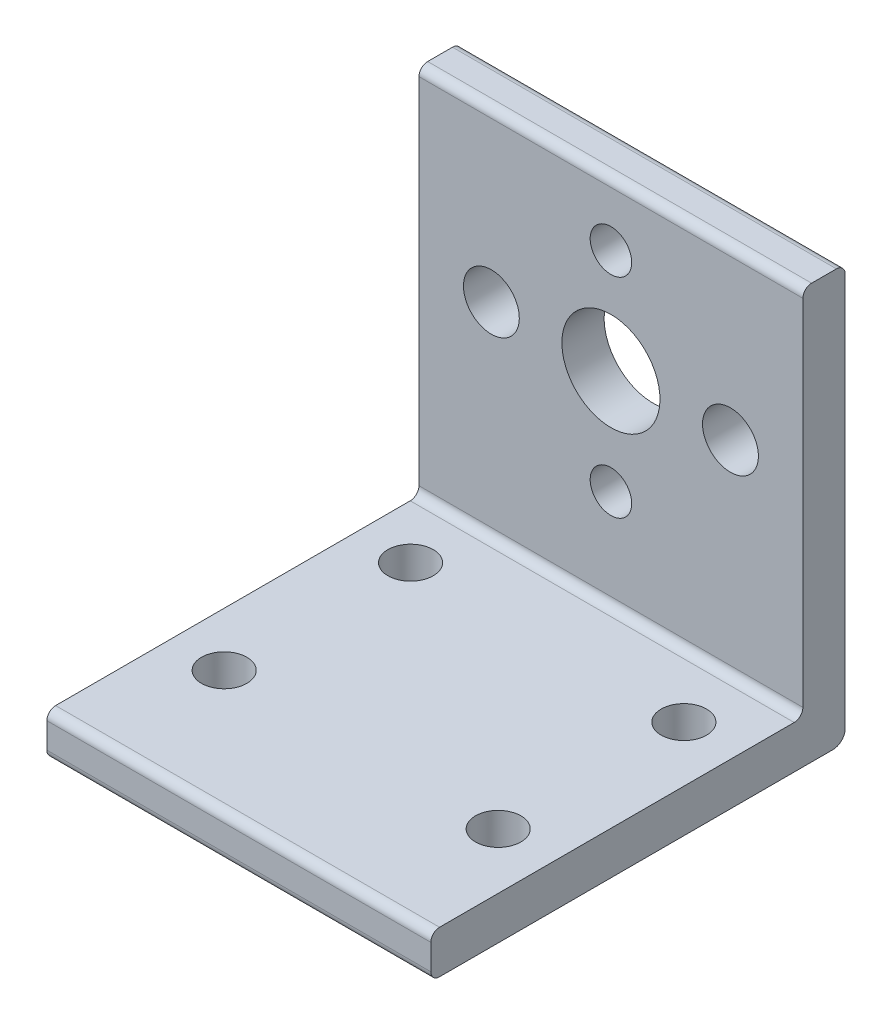
ISO-10303-21;
HEADER;
FILE_DESCRIPTION(('STEP AP214'),'2;1');
FILE_NAME('part.step','',(''),(''),'','','');
FILE_SCHEMA(('AUTOMOTIVE_DESIGN { 1 0 10303 214 1 1 1 1 }'));
ENDSEC;
DATA;
#1=APPLICATION_CONTEXT('core data for automotive mechanical design processes');
#2=APPLICATION_PROTOCOL_DEFINITION('international standard','automotive_design',2000,#1);
#3=PRODUCT_CONTEXT('',#1,'mechanical');
#4=PRODUCT('Part','Part','',(#3));
#5=PRODUCT_RELATED_PRODUCT_CATEGORY('part','',(#4));
#6=PRODUCT_DEFINITION_FORMATION('','',#4);
#7=PRODUCT_DEFINITION_CONTEXT('part definition',#1,'design');
#8=PRODUCT_DEFINITION('design','',#6,#7);
#9=PRODUCT_DEFINITION_SHAPE('','',#8);
#10=(LENGTH_UNIT() NAMED_UNIT(*) SI_UNIT(.MILLI.,.METRE.));
#11=(NAMED_UNIT(*) PLANE_ANGLE_UNIT() SI_UNIT($,.RADIAN.));
#12=(NAMED_UNIT(*) SI_UNIT($,.STERADIAN.) SOLID_ANGLE_UNIT());
#13=UNCERTAINTY_MEASURE_WITH_UNIT(LENGTH_MEASURE(1.E-05),#10,'distance_accuracy_value','');
#14=(GEOMETRIC_REPRESENTATION_CONTEXT(3) GLOBAL_UNCERTAINTY_ASSIGNED_CONTEXT((#13)) GLOBAL_UNIT_ASSIGNED_CONTEXT((#10,
#11,#12)) REPRESENTATION_CONTEXT('',''));
#15=CARTESIAN_POINT('',(0.,0.,0.));
#16=DIRECTION('',(0.,0.,1.));
#17=DIRECTION('',(1.,0.,0.));
#18=AXIS2_PLACEMENT_3D('',#15,#16,#17);
#19=CARTESIAN_POINT('',(27.94,0.,3.0734));
#20=DIRECTION('',(0.,-1.,0.));
#21=DIRECTION('',(0.,0.,-1.));
#22=AXIS2_PLACEMENT_3D('',#19,#20,#21);
#23=PLANE('',#22);
#24=DIRECTION('',(0.,0.,1.));
#25=VECTOR('',#24,1.);
#26=CARTESIAN_POINT('',(27.94,0.,3.0734));
#27=LINE('',#26,#25);
#28=CARTESIAN_POINT('',(27.94,0.,0.635000000000001));
#29=VERTEX_POINT('',#28);
#30=CARTESIAN_POINT('',(27.94,0.,2.4384));
#31=VERTEX_POINT('',#30);
#32=EDGE_CURVE('E182',#29,#31,#27,.T.);
#33=ORIENTED_EDGE('',*,*,#32,.F.);
#34=DIRECTION('',(-1.,0.,0.));
#35=VECTOR('',#34,1.);
#36=CARTESIAN_POINT('',(27.94,0.,0.635));
#37=LINE('',#36,#35);
#38=CARTESIAN_POINT('',(0.,0.,0.635000000000001));
#39=VERTEX_POINT('',#38);
#40=EDGE_CURVE('E241',#29,#39,#37,.T.);
#41=ORIENTED_EDGE('',*,*,#40,.T.);
#42=DIRECTION('',(0.,0.,1.));
#43=VECTOR('',#42,1.);
#44=CARTESIAN_POINT('',(0.,0.,3.0734));
#45=LINE('',#44,#43);
#46=CARTESIAN_POINT('',(0.,0.,2.4384));
#47=VERTEX_POINT('',#46);
#48=EDGE_CURVE('E173',#39,#47,#45,.T.);
#49=ORIENTED_EDGE('',*,*,#48,.T.);
#50=DIRECTION('',(-1.,0.,0.));
#51=VECTOR('',#50,1.);
#52=CARTESIAN_POINT('',(27.94,0.,2.4384));
#53=LINE('',#52,#51);
#54=EDGE_CURVE('E238',#47,#31,#53,.F.);
#55=ORIENTED_EDGE('',*,*,#54,.T.);
#56=EDGE_LOOP('',(#33,#41,#49,#55));
#57=FACE_BOUND('',#56,.T.);
#58=ADVANCED_FACE('F47',(#57),#23,.F.);
#59=CARTESIAN_POINT('',(27.94,-27.051,3.0734));
#60=DIRECTION('',(0.,0.,-1.));
#61=DIRECTION('',(0.,1.,0.));
#62=AXIS2_PLACEMENT_3D('',#59,#60,#61);
#63=PLANE('',#62);
#64=CARTESIAN_POINT('',(13.97,-4.6101,3.0734));
#65=DIRECTION('',(0.,0.,-1.));
#66=DIRECTION('',(0.,1.,0.));
#67=AXIS2_PLACEMENT_3D('',#64,#65,#66);
#68=CIRCLE('',#67,1.5113);
#69=CARTESIAN_POINT('',(13.97,-3.0988,3.0734));
#70=VERTEX_POINT('',#69);
#71=EDGE_CURVE('E268',#70,#70,#68,.F.);
#72=ORIENTED_EDGE('',*,*,#71,.F.);
#73=EDGE_LOOP('',(#72));
#74=FACE_BOUND('',#73,.T.);
#75=CARTESIAN_POINT('',(5.2705,-12.2047,3.0734));
#76=DIRECTION('',(0.,0.,-1.));
#77=DIRECTION('',(0.,1.,0.));
#78=AXIS2_PLACEMENT_3D('',#75,#76,#77);
#79=CIRCLE('',#78,2.032);
#80=CARTESIAN_POINT('',(5.2705,-10.1727,3.0734));
#81=VERTEX_POINT('',#80);
#82=EDGE_CURVE('E271',#81,#81,#79,.F.);
#83=ORIENTED_EDGE('',*,*,#82,.F.);
#84=EDGE_LOOP('',(#83));
#85=FACE_BOUND('',#84,.T.);
#86=CARTESIAN_POINT('',(22.6695,-12.2047,3.0734));
#87=DIRECTION('',(0.,0.,-1.));
#88=DIRECTION('',(0.,1.,0.));
#89=AXIS2_PLACEMENT_3D('',#86,#87,#88);
#90=CIRCLE('',#89,2.032);
#91=CARTESIAN_POINT('',(22.6695,-10.1727,3.0734));
#92=VERTEX_POINT('',#91);
#93=EDGE_CURVE('E289',#92,#92,#90,.F.);
#94=ORIENTED_EDGE('',*,*,#93,.F.);
#95=EDGE_LOOP('',(#94));
#96=FACE_BOUND('',#95,.T.);
#97=CARTESIAN_POINT('',(13.97,-19.7993,3.0734));
#98=DIRECTION('',(0.,0.,-1.));
#99=DIRECTION('',(0.,1.,0.));
#100=AXIS2_PLACEMENT_3D('',#97,#98,#99);
#101=CIRCLE('',#100,1.5113);
#102=CARTESIAN_POINT('',(13.97,-18.288,3.0734));
#103=VERTEX_POINT('',#102);
#104=EDGE_CURVE('E293',#103,#103,#101,.F.);
#105=ORIENTED_EDGE('',*,*,#104,.F.);
#106=EDGE_LOOP('',(#105));
#107=FACE_BOUND('',#106,.T.);
#108=CARTESIAN_POINT('',(13.97,-12.2047,3.0734));
#109=DIRECTION('',(0.,0.,-1.));
#110=DIRECTION('',(0.,1.,0.));
#111=AXIS2_PLACEMENT_3D('',#108,#109,#110);
#112=CIRCLE('',#111,3.5687);
#113=CARTESIAN_POINT('',(13.97,-8.636,3.0734));
#114=VERTEX_POINT('',#113);
#115=EDGE_CURVE('E297',#114,#114,#112,.F.);
#116=ORIENTED_EDGE('',*,*,#115,.F.);
#117=EDGE_LOOP('',(#116));
#118=FACE_BOUND('',#117,.T.);
#119=DIRECTION('',(0.,-1.,0.));
#120=VECTOR('',#119,1.);
#121=CARTESIAN_POINT('',(27.94,-27.051,3.0734));
#122=LINE('',#121,#120);
#123=CARTESIAN_POINT('',(27.94,-0.635,3.0734));
#124=VERTEX_POINT('',#123);
#125=CARTESIAN_POINT('',(27.94,-26.416,3.0734));
#126=VERTEX_POINT('',#125);
#127=EDGE_CURVE('E281',#124,#126,#122,.T.);
#128=ORIENTED_EDGE('',*,*,#127,.F.);
#129=DIRECTION('',(-1.,0.,0.));
#130=VECTOR('',#129,1.);
#131=CARTESIAN_POINT('',(27.94,-0.635,3.0734));
#132=LINE('',#131,#130);
#133=CARTESIAN_POINT('',(0.,-0.635,3.0734));
#134=VERTEX_POINT('',#133);
#135=EDGE_CURVE('E11',#124,#134,#132,.T.);
#136=ORIENTED_EDGE('',*,*,#135,.T.);
#137=DIRECTION('',(0.,-1.,0.));
#138=VECTOR('',#137,1.);
#139=CARTESIAN_POINT('',(0.,-27.051,3.0734));
#140=LINE('',#139,#138);
#141=CARTESIAN_POINT('',(0.,-26.416,3.0734));
#142=VERTEX_POINT('',#141);
#143=EDGE_CURVE('E166',#134,#142,#140,.T.);
#144=ORIENTED_EDGE('',*,*,#143,.T.);
#145=DIRECTION('',(-1.,0.,0.));
#146=VECTOR('',#145,1.);
#147=CARTESIAN_POINT('',(27.94,-26.416,3.0734));
#148=LINE('',#147,#146);
#149=EDGE_CURVE('E147',#142,#126,#148,.F.);
#150=ORIENTED_EDGE('',*,*,#149,.T.);
#151=EDGE_LOOP('',(#128,#136,#144,#150));
#152=FACE_BOUND('',#151,.T.);
#153=ADVANCED_FACE('F368',(#74,#85,#96,#107,#118,#152),#63,.F.);
#154=CARTESIAN_POINT('',(27.94,-27.051,30.1498));
#155=DIRECTION('',(0.,-1.,0.));
#156=DIRECTION('',(0.,0.,-1.));
#157=AXIS2_PLACEMENT_3D('',#154,#155,#156);
#158=PLANE('',#157);
#159=CARTESIAN_POINT('',(23.9014,-27.051,7.6962));
#160=DIRECTION('',(0.,-1.,0.));
#161=DIRECTION('',(0.,0.,-1.));
#162=AXIS2_PLACEMENT_3D('',#159,#160,#161);
#163=CIRCLE('',#162,1.651);
#164=CARTESIAN_POINT('',(23.9014,-27.051,6.0452));
#165=VERTEX_POINT('',#164);
#166=EDGE_CURVE('E318',#165,#165,#163,.F.);
#167=ORIENTED_EDGE('',*,*,#166,.F.);
#168=EDGE_LOOP('',(#167));
#169=FACE_BOUND('',#168,.T.);
#170=CARTESIAN_POINT('',(3.9116,-27.051,21.1582));
#171=DIRECTION('',(0.,-1.,0.));
#172=DIRECTION('',(0.,0.,-1.));
#173=AXIS2_PLACEMENT_3D('',#170,#171,#172);
#174=CIRCLE('',#173,1.651);
#175=CARTESIAN_POINT('',(3.9116,-27.051,19.5072));
#176=VERTEX_POINT('',#175);
#177=EDGE_CURVE('E325',#176,#176,#174,.F.);
#178=ORIENTED_EDGE('',*,*,#177,.F.);
#179=EDGE_LOOP('',(#178));
#180=FACE_BOUND('',#179,.T.);
#181=CARTESIAN_POINT('',(23.876,-27.051,21.1836));
#182=DIRECTION('',(0.,-1.,0.));
#183=DIRECTION('',(0.,0.,-1.));
#184=AXIS2_PLACEMENT_3D('',#181,#182,#183);
#185=CIRCLE('',#184,1.651);
#186=CARTESIAN_POINT('',(23.876,-27.051,19.5326));
#187=VERTEX_POINT('',#186);
#188=EDGE_CURVE('E329',#187,#187,#185,.F.);
#189=ORIENTED_EDGE('',*,*,#188,.F.);
#190=EDGE_LOOP('',(#189));
#191=FACE_BOUND('',#190,.T.);
#192=CARTESIAN_POINT('',(3.9116,-27.051,7.5946));
#193=DIRECTION('',(0.,-1.,0.));
#194=DIRECTION('',(0.,0.,-1.));
#195=AXIS2_PLACEMENT_3D('',#192,#193,#194);
#196=CIRCLE('',#195,1.651);
#197=CARTESIAN_POINT('',(3.9116,-27.051,5.9436));
#198=VERTEX_POINT('',#197);
#199=EDGE_CURVE('E333',#198,#198,#196,.F.);
#200=ORIENTED_EDGE('',*,*,#199,.F.);
#201=EDGE_LOOP('',(#200));
#202=FACE_BOUND('',#201,.T.);
#203=DIRECTION('',(0.,0.,1.));
#204=VECTOR('',#203,1.);
#205=CARTESIAN_POINT('',(0.,-27.051,30.1498));
#206=LINE('',#205,#204);
#207=CARTESIAN_POINT('',(0.,-27.051,3.7084));
#208=VERTEX_POINT('',#207);
#209=CARTESIAN_POINT('',(0.,-27.051,29.5148));
#210=VERTEX_POINT('',#209);
#211=EDGE_CURVE('E155',#208,#210,#206,.T.);
#212=ORIENTED_EDGE('',*,*,#211,.T.);
#213=DIRECTION('',(-1.,0.,0.));
#214=VECTOR('',#213,1.);
#215=CARTESIAN_POINT('',(27.94,-27.051,29.5148));
#216=LINE('',#215,#214);
#217=CARTESIAN_POINT('',(27.94,-27.051,29.5148));
#218=VERTEX_POINT('',#217);
#219=EDGE_CURVE('E63',#210,#218,#216,.F.);
#220=ORIENTED_EDGE('',*,*,#219,.T.);
#221=DIRECTION('',(0.,0.,1.));
#222=VECTOR('',#221,1.);
#223=CARTESIAN_POINT('',(27.94,-27.051,30.1498));
#224=LINE('',#223,#222);
#225=CARTESIAN_POINT('',(27.94,-27.051,3.7084));
#226=VERTEX_POINT('',#225);
#227=EDGE_CURVE('E156',#226,#218,#224,.T.);
#228=ORIENTED_EDGE('',*,*,#227,.F.);
#229=DIRECTION('',(-1.,0.,0.));
#230=VECTOR('',#229,1.);
#231=CARTESIAN_POINT('',(0.,-27.051,3.7084));
#232=LINE('',#231,#230);
#233=EDGE_CURVE('E145',#226,#208,#232,.T.);
#234=ORIENTED_EDGE('',*,*,#233,.T.);
#235=EDGE_LOOP('',(#212,#220,#228,#234));
#236=FACE_BOUND('',#235,.T.);
#237=ADVANCED_FACE('F154',(#169,#180,#191,#202,#236),#158,.F.);
#238=CARTESIAN_POINT('',(27.94,-30.1752,30.1498));
#239=DIRECTION('',(0.,0.,-1.));
#240=DIRECTION('',(-1.,0.,0.));
#241=AXIS2_PLACEMENT_3D('',#238,#239,#240);
#242=PLANE('',#241);
#243=DIRECTION('',(0.,-1.,0.));
#244=VECTOR('',#243,1.);
#245=CARTESIAN_POINT('',(0.,-30.1752,30.1498));
#246=LINE('',#245,#244);
#247=CARTESIAN_POINT('',(0.,-27.686,30.1498));
#248=VERTEX_POINT('',#247);
#249=CARTESIAN_POINT('',(0.,-29.5402,30.1498));
#250=VERTEX_POINT('',#249);
#251=EDGE_CURVE('E165',#248,#250,#246,.T.);
#252=ORIENTED_EDGE('',*,*,#251,.T.);
#253=DIRECTION('',(-1.,0.,0.));
#254=VECTOR('',#253,1.);
#255=CARTESIAN_POINT('',(27.94,-29.5402,30.1498));
#256=LINE('',#255,#254);
#257=CARTESIAN_POINT('',(27.94,-29.5402,30.1498));
#258=VERTEX_POINT('',#257);
#259=EDGE_CURVE('E222',#250,#258,#256,.F.);
#260=ORIENTED_EDGE('',*,*,#259,.T.);
#261=DIRECTION('',(0.,-1.,0.));
#262=VECTOR('',#261,1.);
#263=CARTESIAN_POINT('',(27.94,-30.1752,30.1498));
#264=LINE('',#263,#262);
#265=CARTESIAN_POINT('',(27.94,-27.686,30.1498));
#266=VERTEX_POINT('',#265);
#267=EDGE_CURVE('E276',#266,#258,#264,.T.);
#268=ORIENTED_EDGE('',*,*,#267,.F.);
#269=DIRECTION('',(-1.,0.,0.));
#270=VECTOR('',#269,1.);
#271=CARTESIAN_POINT('',(27.94,-27.686,30.1498));
#272=LINE('',#271,#270);
#273=EDGE_CURVE('E218',#266,#248,#272,.T.);
#274=ORIENTED_EDGE('',*,*,#273,.T.);
#275=EDGE_LOOP('',(#252,#260,#268,#274));
#276=FACE_BOUND('',#275,.T.);
#277=ADVANCED_FACE('F367',(#276),#242,.F.);
#278=CARTESIAN_POINT('',(27.94,-30.1752,0.));
#279=DIRECTION('',(0.,1.,0.));
#280=DIRECTION('',(0.,0.,1.));
#281=AXIS2_PLACEMENT_3D('',#278,#279,#280);
#282=PLANE('',#281);
#283=CARTESIAN_POINT('',(23.9014,-30.1752,7.6962));
#284=DIRECTION('',(0.,1.,0.));
#285=DIRECTION('',(0.,0.,1.));
#286=AXIS2_PLACEMENT_3D('',#283,#284,#285);
#287=CIRCLE('',#286,1.651);
#288=CARTESIAN_POINT('',(23.9014,-30.1752,9.3472));
#289=VERTEX_POINT('',#288);
#290=EDGE_CURVE('E341',#289,#289,#287,.T.);
#291=ORIENTED_EDGE('',*,*,#290,.T.);
#292=EDGE_LOOP('',(#291));
#293=FACE_BOUND('',#292,.T.);
#294=CARTESIAN_POINT('',(3.9116,-30.1752,21.1582));
#295=DIRECTION('',(0.,1.,0.));
#296=DIRECTION('',(0.,0.,1.));
#297=AXIS2_PLACEMENT_3D('',#294,#295,#296);
#298=CIRCLE('',#297,1.651);
#299=CARTESIAN_POINT('',(3.9116,-30.1752,22.8092));
#300=VERTEX_POINT('',#299);
#301=EDGE_CURVE('E342',#300,#300,#298,.T.);
#302=ORIENTED_EDGE('',*,*,#301,.T.);
#303=EDGE_LOOP('',(#302));
#304=FACE_BOUND('',#303,.T.);
#305=CARTESIAN_POINT('',(23.876,-30.1752,21.1836));
#306=DIRECTION('',(0.,1.,0.));
#307=DIRECTION('',(0.,0.,1.));
#308=AXIS2_PLACEMENT_3D('',#305,#306,#307);
#309=CIRCLE('',#308,1.651);
#310=CARTESIAN_POINT('',(23.876,-30.1752,22.8346));
#311=VERTEX_POINT('',#310);
#312=EDGE_CURVE('E346',#311,#311,#309,.T.);
#313=ORIENTED_EDGE('',*,*,#312,.T.);
#314=EDGE_LOOP('',(#313));
#315=FACE_BOUND('',#314,.T.);
#316=CARTESIAN_POINT('',(3.9116,-30.1752,7.5946));
#317=DIRECTION('',(0.,1.,0.));
#318=DIRECTION('',(0.,0.,1.));
#319=AXIS2_PLACEMENT_3D('',#316,#317,#318);
#320=CIRCLE('',#319,1.651);
#321=CARTESIAN_POINT('',(3.9116,-30.1752,9.2456));
#322=VERTEX_POINT('',#321);
#323=EDGE_CURVE('E337',#322,#322,#320,.T.);
#324=ORIENTED_EDGE('',*,*,#323,.T.);
#325=EDGE_LOOP('',(#324));
#326=FACE_BOUND('',#325,.T.);
#327=DIRECTION('',(0.,0.,-1.));
#328=VECTOR('',#327,1.);
#329=CARTESIAN_POINT('',(27.94,-30.1752,0.));
#330=LINE('',#329,#328);
#331=CARTESIAN_POINT('',(27.94,-30.1752,29.5148));
#332=VERTEX_POINT('',#331);
#333=CARTESIAN_POINT('',(27.94,-30.1752,0.888999999999996));
#334=VERTEX_POINT('',#333);
#335=EDGE_CURVE('E259',#332,#334,#330,.T.);
#336=ORIENTED_EDGE('',*,*,#335,.F.);
#337=DIRECTION('',(-1.,0.,0.));
#338=VECTOR('',#337,1.);
#339=CARTESIAN_POINT('',(27.94,-30.1752,29.5148));
#340=LINE('',#339,#338);
#341=CARTESIAN_POINT('',(0.,-30.1752,29.5148));
#342=VERTEX_POINT('',#341);
#343=EDGE_CURVE('E203',#332,#342,#340,.T.);
#344=ORIENTED_EDGE('',*,*,#343,.T.);
#345=DIRECTION('',(0.,0.,-1.));
#346=VECTOR('',#345,1.);
#347=CARTESIAN_POINT('',(0.,-30.1752,0.));
#348=LINE('',#347,#346);
#349=CARTESIAN_POINT('',(0.,-30.1752,0.888999999999996));
#350=VERTEX_POINT('',#349);
#351=EDGE_CURVE('E171',#342,#350,#348,.T.);
#352=ORIENTED_EDGE('',*,*,#351,.T.);
#353=DIRECTION('',(-1.,0.,0.));
#354=VECTOR('',#353,1.);
#355=CARTESIAN_POINT('',(27.94,-30.1752,0.888999999999996));
#356=LINE('',#355,#354);
#357=EDGE_CURVE('E196',#350,#334,#356,.F.);
#358=ORIENTED_EDGE('',*,*,#357,.T.);
#359=EDGE_LOOP('',(#336,#344,#352,#358));
#360=FACE_BOUND('',#359,.T.);
#361=ADVANCED_FACE('F354',(#293,#304,#315,#326,#360),#282,.F.);
#362=CARTESIAN_POINT('',(27.94,0.,0.));
#363=DIRECTION('',(0.,0.,1.));
#364=DIRECTION('',(0.,-1.,0.));
#365=AXIS2_PLACEMENT_3D('',#362,#363,#364);
#366=PLANE('',#365);
#367=CARTESIAN_POINT('',(13.97,-4.6101,0.));
#368=DIRECTION('',(0.,0.,1.));
#369=DIRECTION('',(1.,0.,0.));
#370=AXIS2_PLACEMENT_3D('',#367,#368,#369);
#371=CIRCLE('',#370,1.5113);
#372=CARTESIAN_POINT('',(15.4813,-4.6101,0.));
#373=VERTEX_POINT('',#372);
#374=EDGE_CURVE('E305',#373,#373,#371,.T.);
#375=ORIENTED_EDGE('',*,*,#374,.T.);
#376=EDGE_LOOP('',(#375));
#377=FACE_BOUND('',#376,.T.);
#378=CARTESIAN_POINT('',(5.2705,-12.2047,0.));
#379=DIRECTION('',(0.,0.,1.));
#380=DIRECTION('',(1.,0.,0.));
#381=AXIS2_PLACEMENT_3D('',#378,#379,#380);
#382=CIRCLE('',#381,2.032);
#383=CARTESIAN_POINT('',(7.3025,-12.2047,0.));
#384=VERTEX_POINT('',#383);
#385=EDGE_CURVE('E306',#384,#384,#382,.T.);
#386=ORIENTED_EDGE('',*,*,#385,.T.);
#387=EDGE_LOOP('',(#386));
#388=FACE_BOUND('',#387,.T.);
#389=CARTESIAN_POINT('',(22.6695,-12.2047,0.));
#390=DIRECTION('',(0.,0.,1.));
#391=DIRECTION('',(-1.,0.,0.));
#392=AXIS2_PLACEMENT_3D('',#389,#390,#391);
#393=CIRCLE('',#392,2.032);
#394=CARTESIAN_POINT('',(20.6375,-12.2047,0.));
#395=VERTEX_POINT('',#394);
#396=EDGE_CURVE('E310',#395,#395,#393,.T.);
#397=ORIENTED_EDGE('',*,*,#396,.T.);
#398=EDGE_LOOP('',(#397));
#399=FACE_BOUND('',#398,.T.);
#400=CARTESIAN_POINT('',(13.97,-19.7993,0.));
#401=DIRECTION('',(0.,0.,1.));
#402=DIRECTION('',(-1.,0.,0.));
#403=AXIS2_PLACEMENT_3D('',#400,#401,#402);
#404=CIRCLE('',#403,1.5113);
#405=CARTESIAN_POINT('',(12.4587,-19.7993,0.));
#406=VERTEX_POINT('',#405);
#407=EDGE_CURVE('E314',#406,#406,#404,.T.);
#408=ORIENTED_EDGE('',*,*,#407,.T.);
#409=EDGE_LOOP('',(#408));
#410=FACE_BOUND('',#409,.T.);
#411=CARTESIAN_POINT('',(13.97,-12.2047,0.));
#412=DIRECTION('',(0.,0.,1.));
#413=DIRECTION('',(1.,0.,0.));
#414=AXIS2_PLACEMENT_3D('',#411,#412,#413);
#415=CIRCLE('',#414,3.5687);
#416=CARTESIAN_POINT('',(17.5387,-12.2047,0.));
#417=VERTEX_POINT('',#416);
#418=EDGE_CURVE('E301',#417,#417,#415,.T.);
#419=ORIENTED_EDGE('',*,*,#418,.T.);
#420=EDGE_LOOP('',(#419));
#421=FACE_BOUND('',#420,.T.);
#422=DIRECTION('',(0.,1.,0.));
#423=VECTOR('',#422,1.);
#424=CARTESIAN_POINT('',(0.,0.,0.));
#425=LINE('',#424,#423);
#426=CARTESIAN_POINT('',(0.,-29.2862,0.));
#427=VERTEX_POINT('',#426);
#428=CARTESIAN_POINT('',(0.,-0.635,0.));
#429=VERTEX_POINT('',#428);
#430=EDGE_CURVE('E179',#427,#429,#425,.T.);
#431=ORIENTED_EDGE('',*,*,#430,.T.);
#432=DIRECTION('',(-1.,0.,0.));
#433=VECTOR('',#432,1.);
#434=CARTESIAN_POINT('',(27.94,-0.635,0.));
#435=LINE('',#434,#433);
#436=CARTESIAN_POINT('',(27.94,-0.635,0.));
#437=VERTEX_POINT('',#436);
#438=EDGE_CURVE('E56',#429,#437,#435,.F.);
#439=ORIENTED_EDGE('',*,*,#438,.T.);
#440=DIRECTION('',(0.,1.,0.));
#441=VECTOR('',#440,1.);
#442=CARTESIAN_POINT('',(27.94,0.,0.));
#443=LINE('',#442,#441);
#444=CARTESIAN_POINT('',(27.94,-29.2862,0.));
#445=VERTEX_POINT('',#444);
#446=EDGE_CURVE('E158',#445,#437,#443,.T.);
#447=ORIENTED_EDGE('',*,*,#446,.F.);
#448=DIRECTION('',(-1.,0.,0.));
#449=VECTOR('',#448,1.);
#450=CARTESIAN_POINT('',(27.94,-29.2862,0.));
#451=LINE('',#450,#449);
#452=EDGE_CURVE('E188',#445,#427,#451,.T.);
#453=ORIENTED_EDGE('',*,*,#452,.T.);
#454=EDGE_LOOP('',(#431,#439,#447,#453));
#455=FACE_BOUND('',#454,.T.);
#456=ADVANCED_FACE('F249',(#377,#388,#399,#410,#421,#455),#366,.F.);
#457=CARTESIAN_POINT('',(27.94,0.,0.));
#458=DIRECTION('',(-1.,0.,0.));
#459=DIRECTION('',(0.,0.,1.));
#460=AXIS2_PLACEMENT_3D('',#457,#458,#459);
#461=PLANE('',#460);
#462=ORIENTED_EDGE('',*,*,#267,.T.);
#463=CARTESIAN_POINT('',(27.94,-29.5402,29.5148));
#464=DIRECTION('',(-1.,0.,0.));
#465=DIRECTION('',(0.,0.,1.));
#466=AXIS2_PLACEMENT_3D('',#463,#464,#465);
#467=CIRCLE('',#466,0.635);
#468=EDGE_CURVE('E233',#258,#332,#467,.F.);
#469=ORIENTED_EDGE('',*,*,#468,.T.);
#470=ORIENTED_EDGE('',*,*,#335,.T.);
#471=CARTESIAN_POINT('',(27.94,-29.2862,0.888999999999996));
#472=DIRECTION('',(-1.,0.,0.));
#473=DIRECTION('',(0.,0.,1.));
#474=AXIS2_PLACEMENT_3D('',#471,#472,#473);
#475=CIRCLE('',#474,0.889);
#476=EDGE_CURVE('E200',#334,#445,#475,.F.);
#477=ORIENTED_EDGE('',*,*,#476,.T.);
#478=ORIENTED_EDGE('',*,*,#446,.T.);
#479=CARTESIAN_POINT('',(27.94,-0.635,0.635));
#480=DIRECTION('',(-1.,0.,0.));
#481=DIRECTION('',(0.,0.,1.));
#482=AXIS2_PLACEMENT_3D('',#479,#480,#481);
#483=CIRCLE('',#482,0.635);
#484=EDGE_CURVE('E227',#437,#29,#483,.F.);
#485=ORIENTED_EDGE('',*,*,#484,.T.);
#486=ORIENTED_EDGE('',*,*,#32,.T.);
#487=CARTESIAN_POINT('',(27.94,-0.635,2.4384));
#488=DIRECTION('',(-1.,0.,0.));
#489=DIRECTION('',(0.,0.,1.));
#490=AXIS2_PLACEMENT_3D('',#487,#488,#489);
#491=CIRCLE('',#490,0.635);
#492=EDGE_CURVE('E71',#31,#124,#491,.F.);
#493=ORIENTED_EDGE('',*,*,#492,.T.);
#494=ORIENTED_EDGE('',*,*,#127,.T.);
#495=CARTESIAN_POINT('',(27.94,-26.416,3.7084));
#496=DIRECTION('',(-1.,0.,0.));
#497=DIRECTION('',(0.,0.,1.));
#498=AXIS2_PLACEMENT_3D('',#495,#496,#497);
#499=CIRCLE('',#498,0.635);
#500=EDGE_CURVE('E152',#126,#226,#499,.T.);
#501=ORIENTED_EDGE('',*,*,#500,.T.);
#502=ORIENTED_EDGE('',*,*,#227,.T.);
#503=CARTESIAN_POINT('',(27.94,-27.686,29.5148));
#504=DIRECTION('',(-1.,0.,0.));
#505=DIRECTION('',(0.,0.,1.));
#506=AXIS2_PLACEMENT_3D('',#503,#504,#505);
#507=CIRCLE('',#506,0.635);
#508=EDGE_CURVE('E230',#218,#266,#507,.F.);
#509=ORIENTED_EDGE('',*,*,#508,.T.);
#510=EDGE_LOOP('',(#462,#469,#470,#477,#478,#485,#486,#493,#494,#501,#502,#509));
#511=FACE_BOUND('',#510,.T.);
#512=ADVANCED_FACE('F255',(#511),#461,.F.);
#513=CARTESIAN_POINT('',(0.,0.,0.));
#514=DIRECTION('',(-1.,0.,0.));
#515=DIRECTION('',(0.,0.,1.));
#516=AXIS2_PLACEMENT_3D('',#513,#514,#515);
#517=PLANE('',#516);
#518=ORIENTED_EDGE('',*,*,#351,.F.);
#519=CARTESIAN_POINT('',(0.,-29.5402,29.5148));
#520=DIRECTION('',(-1.,0.,0.));
#521=DIRECTION('',(0.,0.,1.));
#522=AXIS2_PLACEMENT_3D('',#519,#520,#521);
#523=CIRCLE('',#522,0.635);
#524=EDGE_CURVE('E215',#342,#250,#523,.T.);
#525=ORIENTED_EDGE('',*,*,#524,.T.);
#526=ORIENTED_EDGE('',*,*,#251,.F.);
#527=CARTESIAN_POINT('',(0.,-27.686,29.5148));
#528=DIRECTION('',(-1.,0.,0.));
#529=DIRECTION('',(0.,0.,1.));
#530=AXIS2_PLACEMENT_3D('',#527,#528,#529);
#531=CIRCLE('',#530,0.635);
#532=EDGE_CURVE('E163',#248,#210,#531,.T.);
#533=ORIENTED_EDGE('',*,*,#532,.T.);
#534=ORIENTED_EDGE('',*,*,#211,.F.);
#535=CARTESIAN_POINT('',(0.,-26.416,3.7084));
#536=DIRECTION('',(-1.,0.,0.));
#537=DIRECTION('',(0.,0.,1.));
#538=AXIS2_PLACEMENT_3D('',#535,#536,#537);
#539=CIRCLE('',#538,0.635);
#540=EDGE_CURVE('E141',#208,#142,#539,.F.);
#541=ORIENTED_EDGE('',*,*,#540,.T.);
#542=ORIENTED_EDGE('',*,*,#143,.F.);
#543=CARTESIAN_POINT('',(0.,-0.635,2.4384));
#544=DIRECTION('',(-1.,0.,0.));
#545=DIRECTION('',(0.,0.,1.));
#546=AXIS2_PLACEMENT_3D('',#543,#544,#545);
#547=CIRCLE('',#546,0.635);
#548=EDGE_CURVE('E207',#134,#47,#547,.T.);
#549=ORIENTED_EDGE('',*,*,#548,.T.);
#550=ORIENTED_EDGE('',*,*,#48,.F.);
#551=CARTESIAN_POINT('',(0.,-0.635,0.635));
#552=DIRECTION('',(-1.,0.,0.));
#553=DIRECTION('',(0.,0.,1.));
#554=AXIS2_PLACEMENT_3D('',#551,#552,#553);
#555=CIRCLE('',#554,0.635);
#556=EDGE_CURVE('E210',#39,#429,#555,.T.);
#557=ORIENTED_EDGE('',*,*,#556,.T.);
#558=ORIENTED_EDGE('',*,*,#430,.F.);
#559=CARTESIAN_POINT('',(0.,-29.2862,0.888999999999996));
#560=DIRECTION('',(-1.,0.,0.));
#561=DIRECTION('',(0.,0.,1.));
#562=AXIS2_PLACEMENT_3D('',#559,#560,#561);
#563=CIRCLE('',#562,0.889);
#564=EDGE_CURVE('E192',#427,#350,#563,.T.);
#565=ORIENTED_EDGE('',*,*,#564,.T.);
#566=EDGE_LOOP('',(#518,#525,#526,#533,#534,#541,#542,#549,#550,#557,#558,#565));
#567=FACE_BOUND('',#566,.T.);
#568=ADVANCED_FACE('F161',(#567),#517,.T.);
#569=CARTESIAN_POINT('',(13.97,-12.2047,30.1498));
#570=DIRECTION('',(0.,0.,-1.));
#571=DIRECTION('',(-1.,0.,0.));
#572=AXIS2_PLACEMENT_3D('',#569,#570,#571);
#573=CYLINDRICAL_SURFACE('',#572,3.5687);
#574=ORIENTED_EDGE('',*,*,#418,.F.);
#575=EDGE_LOOP('',(#574));
#576=FACE_BOUND('',#575,.T.);
#577=ORIENTED_EDGE('',*,*,#115,.T.);
#578=EDGE_LOOP('',(#577));
#579=FACE_BOUND('',#578,.T.);
#580=ADVANCED_FACE('F441',(#576,#579),#573,.F.);
#581=CARTESIAN_POINT('',(13.97,-19.7993,30.1498));
#582=DIRECTION('',(0.,0.,-1.));
#583=DIRECTION('',(-1.,0.,0.));
#584=AXIS2_PLACEMENT_3D('',#581,#582,#583);
#585=CYLINDRICAL_SURFACE('',#584,1.5113);
#586=ORIENTED_EDGE('',*,*,#407,.F.);
#587=EDGE_LOOP('',(#586));
#588=FACE_BOUND('',#587,.T.);
#589=ORIENTED_EDGE('',*,*,#104,.T.);
#590=EDGE_LOOP('',(#589));
#591=FACE_BOUND('',#590,.T.);
#592=ADVANCED_FACE('F446',(#588,#591),#585,.F.);
#593=CARTESIAN_POINT('',(22.6695,-12.2047,30.1498));
#594=DIRECTION('',(0.,0.,-1.));
#595=DIRECTION('',(-1.,0.,0.));
#596=AXIS2_PLACEMENT_3D('',#593,#594,#595);
#597=CYLINDRICAL_SURFACE('',#596,2.032);
#598=ORIENTED_EDGE('',*,*,#396,.F.);
#599=EDGE_LOOP('',(#598));
#600=FACE_BOUND('',#599,.T.);
#601=ORIENTED_EDGE('',*,*,#93,.T.);
#602=EDGE_LOOP('',(#601));
#603=FACE_BOUND('',#602,.T.);
#604=ADVANCED_FACE('F449',(#600,#603),#597,.F.);
#605=CARTESIAN_POINT('',(5.2705,-12.2047,30.1498));
#606=DIRECTION('',(0.,0.,-1.));
#607=DIRECTION('',(-1.,0.,0.));
#608=AXIS2_PLACEMENT_3D('',#605,#606,#607);
#609=CYLINDRICAL_SURFACE('',#608,2.032);
#610=ORIENTED_EDGE('',*,*,#385,.F.);
#611=EDGE_LOOP('',(#610));
#612=FACE_BOUND('',#611,.T.);
#613=ORIENTED_EDGE('',*,*,#82,.T.);
#614=EDGE_LOOP('',(#613));
#615=FACE_BOUND('',#614,.T.);
#616=ADVANCED_FACE('F380',(#612,#615),#609,.F.);
#617=CARTESIAN_POINT('',(13.97,-4.6101,30.1498));
#618=DIRECTION('',(0.,0.,-1.));
#619=DIRECTION('',(-1.,0.,0.));
#620=AXIS2_PLACEMENT_3D('',#617,#618,#619);
#621=CYLINDRICAL_SURFACE('',#620,1.5113);
#622=ORIENTED_EDGE('',*,*,#374,.F.);
#623=EDGE_LOOP('',(#622));
#624=FACE_BOUND('',#623,.T.);
#625=ORIENTED_EDGE('',*,*,#71,.T.);
#626=EDGE_LOOP('',(#625));
#627=FACE_BOUND('',#626,.T.);
#628=ADVANCED_FACE('F374',(#624,#627),#621,.F.);
#629=CARTESIAN_POINT('',(3.9116,0.,7.5946));
#630=DIRECTION('',(0.,-1.,0.));
#631=DIRECTION('',(0.,0.,-1.));
#632=AXIS2_PLACEMENT_3D('',#629,#630,#631);
#633=CYLINDRICAL_SURFACE('',#632,1.651);
#634=ORIENTED_EDGE('',*,*,#323,.F.);
#635=EDGE_LOOP('',(#634));
#636=FACE_BOUND('',#635,.T.);
#637=ORIENTED_EDGE('',*,*,#199,.T.);
#638=EDGE_LOOP('',(#637));
#639=FACE_BOUND('',#638,.T.);
#640=ADVANCED_FACE('F361',(#636,#639),#633,.F.);
#641=CARTESIAN_POINT('',(23.876,0.,21.1836));
#642=DIRECTION('',(0.,-1.,0.));
#643=DIRECTION('',(0.,0.,-1.));
#644=AXIS2_PLACEMENT_3D('',#641,#642,#643);
#645=CYLINDRICAL_SURFACE('',#644,1.651);
#646=ORIENTED_EDGE('',*,*,#312,.F.);
#647=EDGE_LOOP('',(#646));
#648=FACE_BOUND('',#647,.T.);
#649=ORIENTED_EDGE('',*,*,#188,.T.);
#650=EDGE_LOOP('',(#649));
#651=FACE_BOUND('',#650,.T.);
#652=ADVANCED_FACE('F357',(#648,#651),#645,.F.);
#653=CARTESIAN_POINT('',(3.9116,0.,21.1582));
#654=DIRECTION('',(0.,-1.,0.));
#655=DIRECTION('',(0.,0.,-1.));
#656=AXIS2_PLACEMENT_3D('',#653,#654,#655);
#657=CYLINDRICAL_SURFACE('',#656,1.651);
#658=ORIENTED_EDGE('',*,*,#301,.F.);
#659=EDGE_LOOP('',(#658));
#660=FACE_BOUND('',#659,.T.);
#661=ORIENTED_EDGE('',*,*,#177,.T.);
#662=EDGE_LOOP('',(#661));
#663=FACE_BOUND('',#662,.T.);
#664=ADVANCED_FACE('F360',(#660,#663),#657,.F.);
#665=CARTESIAN_POINT('',(23.9014,0.,7.6962));
#666=DIRECTION('',(0.,-1.,0.));
#667=DIRECTION('',(0.,0.,-1.));
#668=AXIS2_PLACEMENT_3D('',#665,#666,#667);
#669=CYLINDRICAL_SURFACE('',#668,1.651);
#670=ORIENTED_EDGE('',*,*,#290,.F.);
#671=EDGE_LOOP('',(#670));
#672=FACE_BOUND('',#671,.T.);
#673=ORIENTED_EDGE('',*,*,#166,.T.);
#674=EDGE_LOOP('',(#673));
#675=FACE_BOUND('',#674,.T.);
#676=ADVANCED_FACE('F398',(#672,#675),#669,.F.);
#677=CARTESIAN_POINT('',(27.94,-26.416,3.7084));
#678=DIRECTION('',(1.,0.,0.));
#679=DIRECTION('',(0.,0.,-1.));
#680=AXIS2_PLACEMENT_3D('',#677,#678,#679);
#681=CYLINDRICAL_SURFACE('',#680,0.635);
#682=ORIENTED_EDGE('',*,*,#500,.F.);
#683=ORIENTED_EDGE('',*,*,#149,.F.);
#684=ORIENTED_EDGE('',*,*,#540,.F.);
#685=ORIENTED_EDGE('',*,*,#233,.F.);
#686=EDGE_LOOP('',(#682,#683,#684,#685));
#687=FACE_BOUND('',#686,.T.);
#688=ADVANCED_FACE('F144',(#687),#681,.F.);
#689=CARTESIAN_POINT('',(27.94,-29.2862,0.888999999999996));
#690=DIRECTION('',(-1.,0.,0.));
#691=DIRECTION('',(0.,0.,1.));
#692=AXIS2_PLACEMENT_3D('',#689,#690,#691);
#693=CYLINDRICAL_SURFACE('',#692,0.889);
#694=ORIENTED_EDGE('',*,*,#476,.F.);
#695=ORIENTED_EDGE('',*,*,#357,.F.);
#696=ORIENTED_EDGE('',*,*,#564,.F.);
#697=ORIENTED_EDGE('',*,*,#452,.F.);
#698=EDGE_LOOP('',(#694,#695,#696,#697));
#699=FACE_BOUND('',#698,.T.);
#700=ADVANCED_FACE('F397',(#699),#693,.T.);
#701=CARTESIAN_POINT('',(27.94,-29.5402,29.5148));
#702=DIRECTION('',(-1.,0.,0.));
#703=DIRECTION('',(0.,0.,1.));
#704=AXIS2_PLACEMENT_3D('',#701,#702,#703);
#705=CYLINDRICAL_SURFACE('',#704,0.635);
#706=ORIENTED_EDGE('',*,*,#468,.F.);
#707=ORIENTED_EDGE('',*,*,#259,.F.);
#708=ORIENTED_EDGE('',*,*,#524,.F.);
#709=ORIENTED_EDGE('',*,*,#343,.F.);
#710=EDGE_LOOP('',(#706,#707,#708,#709));
#711=FACE_BOUND('',#710,.T.);
#712=ADVANCED_FACE('F400',(#711),#705,.T.);
#713=CARTESIAN_POINT('',(27.94,-27.686,29.5148));
#714=DIRECTION('',(-1.,0.,0.));
#715=DIRECTION('',(0.,0.,1.));
#716=AXIS2_PLACEMENT_3D('',#713,#714,#715);
#717=CYLINDRICAL_SURFACE('',#716,0.635);
#718=ORIENTED_EDGE('',*,*,#508,.F.);
#719=ORIENTED_EDGE('',*,*,#219,.F.);
#720=ORIENTED_EDGE('',*,*,#532,.F.);
#721=ORIENTED_EDGE('',*,*,#273,.F.);
#722=EDGE_LOOP('',(#718,#719,#720,#721));
#723=FACE_BOUND('',#722,.T.);
#724=ADVANCED_FACE('F404',(#723),#717,.T.);
#725=CARTESIAN_POINT('',(27.94,-0.635,0.635));
#726=DIRECTION('',(-1.,0.,0.));
#727=DIRECTION('',(0.,0.,1.));
#728=AXIS2_PLACEMENT_3D('',#725,#726,#727);
#729=CYLINDRICAL_SURFACE('',#728,0.635);
#730=ORIENTED_EDGE('',*,*,#484,.F.);
#731=ORIENTED_EDGE('',*,*,#438,.F.);
#732=ORIENTED_EDGE('',*,*,#556,.F.);
#733=ORIENTED_EDGE('',*,*,#40,.F.);
#734=EDGE_LOOP('',(#730,#731,#732,#733));
#735=FACE_BOUND('',#734,.T.);
#736=ADVANCED_FACE('F262',(#735),#729,.T.);
#737=CARTESIAN_POINT('',(27.94,-0.635,2.4384));
#738=DIRECTION('',(-1.,0.,0.));
#739=DIRECTION('',(0.,0.,1.));
#740=AXIS2_PLACEMENT_3D('',#737,#738,#739);
#741=CYLINDRICAL_SURFACE('',#740,0.635);
#742=ORIENTED_EDGE('',*,*,#492,.F.);
#743=ORIENTED_EDGE('',*,*,#54,.F.);
#744=ORIENTED_EDGE('',*,*,#548,.F.);
#745=ORIENTED_EDGE('',*,*,#135,.F.);
#746=EDGE_LOOP('',(#742,#743,#744,#745));
#747=FACE_BOUND('',#746,.T.);
#748=ADVANCED_FACE('F49',(#747),#741,.T.);
#749=CLOSED_SHELL('',(#58,#153,#237,#277,#361,#456,#512,#568,#580,#592,#604,#616,#628,#640,#652,
#664,#676,#688,#700,#712,#724,#736,#748));
#750=MANIFOLD_SOLID_BREP('B2',#749);
#751=ADVANCED_BREP_SHAPE_REPRESENTATION('',(#18,#750),#14);
#752=SHAPE_DEFINITION_REPRESENTATION(#9,#751);
ENDSEC;
END-ISO-10303-21;
